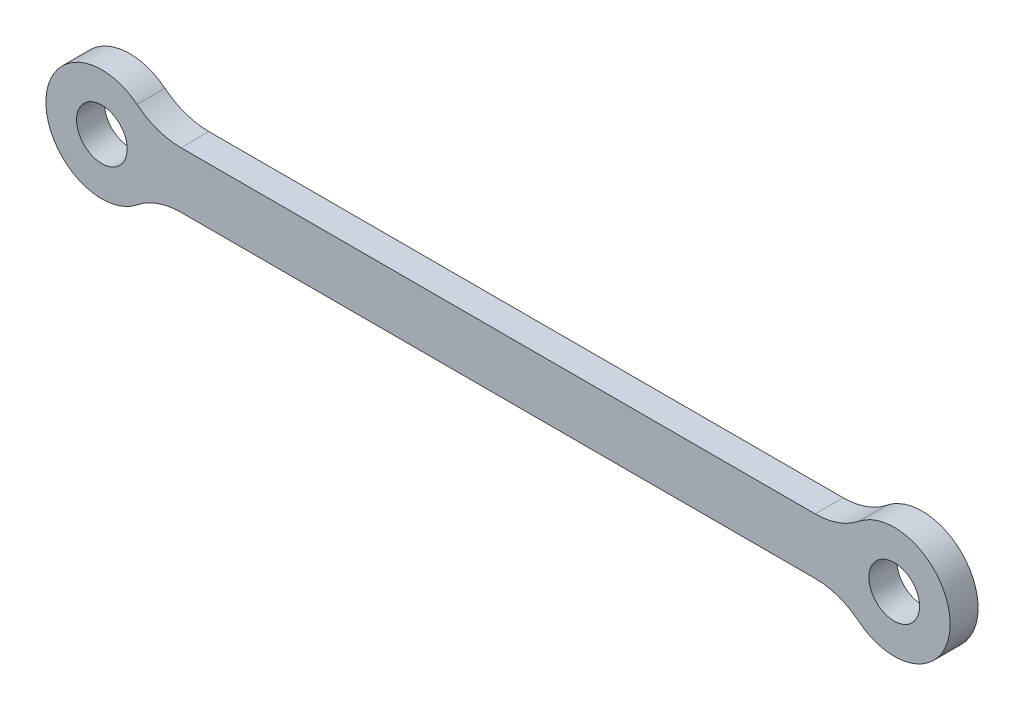
ISO-10303-21;
HEADER;
FILE_DESCRIPTION(('STEP AP214'),'2;1');
FILE_NAME('part.step','',(''),(''),'','','');
FILE_SCHEMA(('AUTOMOTIVE_DESIGN { 1 0 10303 214 1 1 1 1 }'));
ENDSEC;
DATA;
#1=APPLICATION_CONTEXT('core data for automotive mechanical design processes');
#2=APPLICATION_PROTOCOL_DEFINITION('international standard','automotive_design',2000,#1);
#3=PRODUCT_CONTEXT('',#1,'mechanical');
#4=PRODUCT('Part','Part','',(#3));
#5=PRODUCT_RELATED_PRODUCT_CATEGORY('part','',(#4));
#6=PRODUCT_DEFINITION_FORMATION('','',#4);
#7=PRODUCT_DEFINITION_CONTEXT('part definition',#1,'design');
#8=PRODUCT_DEFINITION('design','',#6,#7);
#9=PRODUCT_DEFINITION_SHAPE('','',#8);
#10=(LENGTH_UNIT() NAMED_UNIT(*) SI_UNIT(.MILLI.,.METRE.));
#11=(NAMED_UNIT(*) PLANE_ANGLE_UNIT() SI_UNIT($,.RADIAN.));
#12=(NAMED_UNIT(*) SI_UNIT($,.STERADIAN.) SOLID_ANGLE_UNIT());
#13=UNCERTAINTY_MEASURE_WITH_UNIT(LENGTH_MEASURE(1.E-05),#10,'distance_accuracy_value','');
#14=(GEOMETRIC_REPRESENTATION_CONTEXT(3) GLOBAL_UNCERTAINTY_ASSIGNED_CONTEXT((#13)) GLOBAL_UNIT_ASSIGNED_CONTEXT((#10,
#11,#12)) REPRESENTATION_CONTEXT('',''));
#15=CARTESIAN_POINT('',(0.,0.,0.));
#16=DIRECTION('',(0.,0.,1.));
#17=DIRECTION('',(1.,0.,0.));
#18=AXIS2_PLACEMENT_3D('',#15,#16,#17);
#19=CARTESIAN_POINT('',(129.564923539623,17.78,5.08));
#20=DIRECTION('',(0.,0.,-1.));
#21=DIRECTION('',(-1.,0.,0.));
#22=AXIS2_PLACEMENT_3D('',#19,#20,#21);
#23=PLANE('',#22);
#24=CARTESIAN_POINT('',(129.564923539623,17.78,5.08));
#25=DIRECTION('',(0.,0.,-1.));
#26=DIRECTION('',(-1.,0.,0.));
#27=AXIS2_PLACEMENT_3D('',#24,#25,#26);
#28=CIRCLE('',#27,12.7);
#29=CARTESIAN_POINT('',(137.547373425017,7.90222222222222,5.08));
#30=VERTEX_POINT('',#29);
#31=CARTESIAN_POINT('',(129.564923539623,5.08,5.08));
#32=VERTEX_POINT('',#31);
#33=EDGE_CURVE('E151',#30,#32,#28,.T.);
#34=ORIENTED_EDGE('',*,*,#33,.T.);
#35=DIRECTION('',(-1.,0.,0.));
#36=VECTOR('',#35,1.);
#37=CARTESIAN_POINT('',(14.3684097937106,5.08,5.08));
#38=LINE('',#37,#36);
#39=CARTESIAN_POINT('',(14.3684097937106,5.08,5.08));
#40=VERTEX_POINT('',#39);
#41=EDGE_CURVE('E99',#32,#40,#38,.T.);
#42=ORIENTED_EDGE('',*,*,#41,.T.);
#43=CARTESIAN_POINT('',(14.3684097937106,17.78,5.08));
#44=DIRECTION('',(0.,0.,-1.));
#45=DIRECTION('',(-1.,0.,0.));
#46=AXIS2_PLACEMENT_3D('',#43,#44,#45);
#47=CIRCLE('',#46,12.7);
#48=CARTESIAN_POINT('',(6.38595990831584,7.90222222222223,5.08));
#49=VERTEX_POINT('',#48);
#50=EDGE_CURVE('E166',#40,#49,#47,.T.);
#51=ORIENTED_EDGE('',*,*,#50,.T.);
#52=CARTESIAN_POINT('',(0.,0.,5.08));
#53=DIRECTION('',(0.,0.,1.));
#54=DIRECTION('',(1.,0.,0.));
#55=AXIS2_PLACEMENT_3D('',#52,#53,#54);
#56=CIRCLE('',#55,10.16);
#57=CARTESIAN_POINT('',(6.38595990831584,-7.90222222222222,5.08));
#58=VERTEX_POINT('',#57);
#59=EDGE_CURVE('E179',#49,#58,#56,.T.);
#60=ORIENTED_EDGE('',*,*,#59,.T.);
#61=CARTESIAN_POINT('',(14.3684097937106,-17.78,5.08));
#62=DIRECTION('',(0.,0.,-1.));
#63=DIRECTION('',(1.,0.,0.));
#64=AXIS2_PLACEMENT_3D('',#61,#62,#63);
#65=CIRCLE('',#64,12.7);
#66=CARTESIAN_POINT('',(14.3684097937106,-5.08,5.08));
#67=VERTEX_POINT('',#66);
#68=EDGE_CURVE('E118',#58,#67,#65,.T.);
#69=ORIENTED_EDGE('',*,*,#68,.T.);
#70=DIRECTION('',(1.,0.,0.));
#71=VECTOR('',#70,1.);
#72=CARTESIAN_POINT('',(14.3684097937106,-5.08,5.08));
#73=LINE('',#72,#71);
#74=CARTESIAN_POINT('',(129.564923539623,-5.08,5.08));
#75=VERTEX_POINT('',#74);
#76=EDGE_CURVE('E112',#67,#75,#73,.T.);
#77=ORIENTED_EDGE('',*,*,#76,.T.);
#78=CARTESIAN_POINT('',(129.564923539623,-17.78,5.08));
#79=DIRECTION('',(0.,0.,-1.));
#80=DIRECTION('',(-1.,0.,0.));
#81=AXIS2_PLACEMENT_3D('',#78,#79,#80);
#82=CIRCLE('',#81,12.7);
#83=CARTESIAN_POINT('',(137.547373425017,-7.90222222222222,5.08));
#84=VERTEX_POINT('',#83);
#85=EDGE_CURVE('E116',#75,#84,#82,.T.);
#86=ORIENTED_EDGE('',*,*,#85,.T.);
#87=CARTESIAN_POINT('',(143.933333333333,0.,5.08));
#88=DIRECTION('',(0.,0.,1.));
#89=DIRECTION('',(1.,0.,0.));
#90=AXIS2_PLACEMENT_3D('',#87,#88,#89);
#91=CIRCLE('',#90,10.16);
#92=EDGE_CURVE('E56',#84,#30,#91,.T.);
#93=ORIENTED_EDGE('',*,*,#92,.T.);
#94=EDGE_LOOP('',(#34,#42,#51,#60,#69,#77,#86,#93));
#95=FACE_BOUND('',#94,.T.);
#96=CARTESIAN_POINT('',(0.,0.,5.08));
#97=DIRECTION('',(0.,0.,1.));
#98=DIRECTION('',(1.,0.,0.));
#99=AXIS2_PLACEMENT_3D('',#96,#97,#98);
#100=CIRCLE('',#99,4.60375);
#101=CARTESIAN_POINT('',(4.60375,0.,5.08));
#102=VERTEX_POINT('',#101);
#103=EDGE_CURVE('E140',#102,#102,#100,.T.);
#104=ORIENTED_EDGE('',*,*,#103,.F.);
#105=EDGE_LOOP('',(#104));
#106=FACE_BOUND('',#105,.T.);
#107=CARTESIAN_POINT('',(143.933333333333,0.,5.08));
#108=DIRECTION('',(0.,0.,1.));
#109=DIRECTION('',(1.,0.,0.));
#110=AXIS2_PLACEMENT_3D('',#107,#108,#109);
#111=CIRCLE('',#110,4.60374999999998);
#112=CARTESIAN_POINT('',(148.537083333333,0.,5.08));
#113=VERTEX_POINT('',#112);
#114=EDGE_CURVE('E188',#113,#113,#111,.T.);
#115=ORIENTED_EDGE('',*,*,#114,.F.);
#116=EDGE_LOOP('',(#115));
#117=FACE_BOUND('',#116,.T.);
#118=ADVANCED_FACE('F39',(#95,#106,#117),#23,.F.);
#119=CARTESIAN_POINT('',(129.564923539623,17.78,0.));
#120=DIRECTION('',(0.,0.,-1.));
#121=DIRECTION('',(-1.,0.,0.));
#122=AXIS2_PLACEMENT_3D('',#119,#120,#121);
#123=PLANE('',#122);
#124=CARTESIAN_POINT('',(0.,0.,0.));
#125=DIRECTION('',(0.,0.,1.));
#126=DIRECTION('',(1.,0.,0.));
#127=AXIS2_PLACEMENT_3D('',#124,#125,#126);
#128=CIRCLE('',#127,4.60375);
#129=CARTESIAN_POINT('',(4.60375,0.,0.));
#130=VERTEX_POINT('',#129);
#131=EDGE_CURVE('E185',#130,#130,#128,.T.);
#132=ORIENTED_EDGE('',*,*,#131,.T.);
#133=EDGE_LOOP('',(#132));
#134=FACE_BOUND('',#133,.T.);
#135=CARTESIAN_POINT('',(129.564923539623,17.78,0.));
#136=DIRECTION('',(0.,0.,-1.));
#137=DIRECTION('',(-1.,0.,0.));
#138=AXIS2_PLACEMENT_3D('',#135,#136,#137);
#139=CIRCLE('',#138,12.7);
#140=CARTESIAN_POINT('',(137.547373425017,7.90222222222222,0.));
#141=VERTEX_POINT('',#140);
#142=CARTESIAN_POINT('',(129.564923539623,5.08,0.));
#143=VERTEX_POINT('',#142);
#144=EDGE_CURVE('E136',#141,#143,#139,.T.);
#145=ORIENTED_EDGE('',*,*,#144,.F.);
#146=CARTESIAN_POINT('',(143.933333333333,0.,0.));
#147=DIRECTION('',(0.,0.,1.));
#148=DIRECTION('',(1.,0.,0.));
#149=AXIS2_PLACEMENT_3D('',#146,#147,#148);
#150=CIRCLE('',#149,10.16);
#151=CARTESIAN_POINT('',(137.547373425017,-7.90222222222222,0.));
#152=VERTEX_POINT('',#151);
#153=EDGE_CURVE('E91',#152,#141,#150,.T.);
#154=ORIENTED_EDGE('',*,*,#153,.F.);
#155=CARTESIAN_POINT('',(129.564923539623,-17.78,0.));
#156=DIRECTION('',(0.,0.,-1.));
#157=DIRECTION('',(-1.,0.,0.));
#158=AXIS2_PLACEMENT_3D('',#155,#156,#157);
#159=CIRCLE('',#158,12.7);
#160=CARTESIAN_POINT('',(129.564923539623,-5.08,0.));
#161=VERTEX_POINT('',#160);
#162=EDGE_CURVE('E85',#161,#152,#159,.T.);
#163=ORIENTED_EDGE('',*,*,#162,.F.);
#164=DIRECTION('',(1.,0.,0.));
#165=VECTOR('',#164,1.);
#166=CARTESIAN_POINT('',(14.3684097937106,-5.08,0.));
#167=LINE('',#166,#165);
#168=CARTESIAN_POINT('',(14.3684097937106,-5.08,0.));
#169=VERTEX_POINT('',#168);
#170=EDGE_CURVE('E126',#169,#161,#167,.T.);
#171=ORIENTED_EDGE('',*,*,#170,.F.);
#172=CARTESIAN_POINT('',(14.3684097937106,-17.78,0.));
#173=DIRECTION('',(0.,0.,-1.));
#174=DIRECTION('',(1.,0.,0.));
#175=AXIS2_PLACEMENT_3D('',#172,#173,#174);
#176=CIRCLE('',#175,12.7);
#177=CARTESIAN_POINT('',(6.38595990831584,-7.90222222222222,0.));
#178=VERTEX_POINT('',#177);
#179=EDGE_CURVE('E146',#178,#169,#176,.T.);
#180=ORIENTED_EDGE('',*,*,#179,.F.);
#181=CARTESIAN_POINT('',(0.,0.,0.));
#182=DIRECTION('',(0.,0.,1.));
#183=DIRECTION('',(1.,0.,0.));
#184=AXIS2_PLACEMENT_3D('',#181,#182,#183);
#185=CIRCLE('',#184,10.16);
#186=CARTESIAN_POINT('',(6.38595990831584,7.90222222222223,0.));
#187=VERTEX_POINT('',#186);
#188=EDGE_CURVE('E144',#187,#178,#185,.T.);
#189=ORIENTED_EDGE('',*,*,#188,.F.);
#190=CARTESIAN_POINT('',(14.3684097937106,17.78,0.));
#191=DIRECTION('',(0.,0.,-1.));
#192=DIRECTION('',(-1.,0.,0.));
#193=AXIS2_PLACEMENT_3D('',#190,#191,#192);
#194=CIRCLE('',#193,12.7);
#195=CARTESIAN_POINT('',(14.3684097937106,5.08,0.));
#196=VERTEX_POINT('',#195);
#197=EDGE_CURVE('E142',#196,#187,#194,.T.);
#198=ORIENTED_EDGE('',*,*,#197,.F.);
#199=DIRECTION('',(-1.,0.,0.));
#200=VECTOR('',#199,1.);
#201=CARTESIAN_POINT('',(14.3684097937106,5.08,0.));
#202=LINE('',#201,#200);
#203=EDGE_CURVE('E139',#143,#196,#202,.T.);
#204=ORIENTED_EDGE('',*,*,#203,.F.);
#205=EDGE_LOOP('',(#145,#154,#163,#171,#180,#189,#198,#204));
#206=FACE_BOUND('',#205,.T.);
#207=CARTESIAN_POINT('',(143.933333333333,0.,0.));
#208=DIRECTION('',(0.,0.,1.));
#209=DIRECTION('',(1.,0.,0.));
#210=AXIS2_PLACEMENT_3D('',#207,#208,#209);
#211=CIRCLE('',#210,4.60374999999998);
#212=CARTESIAN_POINT('',(148.537083333333,0.,0.));
#213=VERTEX_POINT('',#212);
#214=EDGE_CURVE('E191',#213,#213,#211,.T.);
#215=ORIENTED_EDGE('',*,*,#214,.T.);
#216=EDGE_LOOP('',(#215));
#217=FACE_BOUND('',#216,.T.);
#218=ADVANCED_FACE('F170',(#134,#206,#217),#123,.T.);
#219=CARTESIAN_POINT('',(129.564923539623,17.78,5.08));
#220=DIRECTION('',(0.,0.,-1.));
#221=DIRECTION('',(-1.,0.,0.));
#222=AXIS2_PLACEMENT_3D('',#219,#220,#221);
#223=CYLINDRICAL_SURFACE('',#222,12.7);
#224=ORIENTED_EDGE('',*,*,#144,.T.);
#225=DIRECTION('',(0.,0.,-1.));
#226=VECTOR('',#225,1.);
#227=CARTESIAN_POINT('',(129.564923539623,5.08,5.08));
#228=LINE('',#227,#226);
#229=EDGE_CURVE('E11',#32,#143,#228,.T.);
#230=ORIENTED_EDGE('',*,*,#229,.F.);
#231=ORIENTED_EDGE('',*,*,#33,.F.);
#232=DIRECTION('',(0.,0.,-1.));
#233=VECTOR('',#232,1.);
#234=CARTESIAN_POINT('',(137.547373425017,7.90222222222222,5.08));
#235=LINE('',#234,#233);
#236=EDGE_CURVE('E132',#30,#141,#235,.T.);
#237=ORIENTED_EDGE('',*,*,#236,.T.);
#238=EDGE_LOOP('',(#224,#230,#231,#237));
#239=FACE_BOUND('',#238,.T.);
#240=ADVANCED_FACE('F41',(#239),#223,.F.);
#241=CARTESIAN_POINT('',(14.3684097937106,5.08,5.08));
#242=DIRECTION('',(0.,-1.,0.));
#243=DIRECTION('',(0.,0.,-1.));
#244=AXIS2_PLACEMENT_3D('',#241,#242,#243);
#245=PLANE('',#244);
#246=ORIENTED_EDGE('',*,*,#203,.T.);
#247=DIRECTION('',(0.,0.,-1.));
#248=VECTOR('',#247,1.);
#249=CARTESIAN_POINT('',(14.3684097937106,5.08,5.08));
#250=LINE('',#249,#248);
#251=EDGE_CURVE('E48',#40,#196,#250,.T.);
#252=ORIENTED_EDGE('',*,*,#251,.F.);
#253=ORIENTED_EDGE('',*,*,#41,.F.);
#254=ORIENTED_EDGE('',*,*,#229,.T.);
#255=EDGE_LOOP('',(#246,#252,#253,#254));
#256=FACE_BOUND('',#255,.T.);
#257=ADVANCED_FACE('F223',(#256),#245,.F.);
#258=CARTESIAN_POINT('',(14.3684097937106,17.78,5.08));
#259=DIRECTION('',(0.,0.,-1.));
#260=DIRECTION('',(-1.,0.,0.));
#261=AXIS2_PLACEMENT_3D('',#258,#259,#260);
#262=CYLINDRICAL_SURFACE('',#261,12.7);
#263=ORIENTED_EDGE('',*,*,#197,.T.);
#264=DIRECTION('',(0.,0.,-1.));
#265=VECTOR('',#264,1.);
#266=CARTESIAN_POINT('',(6.38595990831584,7.90222222222223,5.08));
#267=LINE('',#266,#265);
#268=EDGE_CURVE('E158',#49,#187,#267,.T.);
#269=ORIENTED_EDGE('',*,*,#268,.F.);
#270=ORIENTED_EDGE('',*,*,#50,.F.);
#271=ORIENTED_EDGE('',*,*,#251,.T.);
#272=EDGE_LOOP('',(#263,#269,#270,#271));
#273=FACE_BOUND('',#272,.T.);
#274=ADVANCED_FACE('F164',(#273),#262,.F.);
#275=CARTESIAN_POINT('',(0.,0.,5.08));
#276=DIRECTION('',(0.,0.,-1.));
#277=DIRECTION('',(-1.,0.,0.));
#278=AXIS2_PLACEMENT_3D('',#275,#276,#277);
#279=CYLINDRICAL_SURFACE('',#278,10.16);
#280=ORIENTED_EDGE('',*,*,#188,.T.);
#281=DIRECTION('',(0.,0.,-1.));
#282=VECTOR('',#281,1.);
#283=CARTESIAN_POINT('',(6.38595990831584,-7.90222222222222,5.08));
#284=LINE('',#283,#282);
#285=EDGE_CURVE('E155',#58,#178,#284,.T.);
#286=ORIENTED_EDGE('',*,*,#285,.F.);
#287=ORIENTED_EDGE('',*,*,#59,.F.);
#288=ORIENTED_EDGE('',*,*,#268,.T.);
#289=EDGE_LOOP('',(#280,#286,#287,#288));
#290=FACE_BOUND('',#289,.T.);
#291=ADVANCED_FACE('F175',(#290),#279,.T.);
#292=CARTESIAN_POINT('',(14.3684097937106,-17.78,5.08));
#293=DIRECTION('',(0.,0.,-1.));
#294=DIRECTION('',(-1.,0.,0.));
#295=AXIS2_PLACEMENT_3D('',#292,#293,#294);
#296=CYLINDRICAL_SURFACE('',#295,12.7);
#297=ORIENTED_EDGE('',*,*,#179,.T.);
#298=DIRECTION('',(0.,0.,-1.));
#299=VECTOR('',#298,1.);
#300=CARTESIAN_POINT('',(14.3684097937106,-5.08,5.08));
#301=LINE('',#300,#299);
#302=EDGE_CURVE('E127',#67,#169,#301,.T.);
#303=ORIENTED_EDGE('',*,*,#302,.F.);
#304=ORIENTED_EDGE('',*,*,#68,.F.);
#305=ORIENTED_EDGE('',*,*,#285,.T.);
#306=EDGE_LOOP('',(#297,#303,#304,#305));
#307=FACE_BOUND('',#306,.T.);
#308=ADVANCED_FACE('F178',(#307),#296,.F.);
#309=CARTESIAN_POINT('',(14.3684097937106,-5.08,5.08));
#310=DIRECTION('',(0.,1.,0.));
#311=DIRECTION('',(0.,0.,1.));
#312=AXIS2_PLACEMENT_3D('',#309,#310,#311);
#313=PLANE('',#312);
#314=ORIENTED_EDGE('',*,*,#170,.T.);
#315=DIRECTION('',(0.,0.,-1.));
#316=VECTOR('',#315,1.);
#317=CARTESIAN_POINT('',(129.564923539623,-5.08,5.08));
#318=LINE('',#317,#316);
#319=EDGE_CURVE('E123',#75,#161,#318,.T.);
#320=ORIENTED_EDGE('',*,*,#319,.F.);
#321=ORIENTED_EDGE('',*,*,#76,.F.);
#322=ORIENTED_EDGE('',*,*,#302,.T.);
#323=EDGE_LOOP('',(#314,#320,#321,#322));
#324=FACE_BOUND('',#323,.T.);
#325=ADVANCED_FACE('F124',(#324),#313,.F.);
#326=CARTESIAN_POINT('',(129.564923539623,-17.78,5.08));
#327=DIRECTION('',(0.,0.,-1.));
#328=DIRECTION('',(-1.,0.,0.));
#329=AXIS2_PLACEMENT_3D('',#326,#327,#328);
#330=CYLINDRICAL_SURFACE('',#329,12.7);
#331=ORIENTED_EDGE('',*,*,#162,.T.);
#332=DIRECTION('',(0.,0.,-1.));
#333=VECTOR('',#332,1.);
#334=CARTESIAN_POINT('',(137.547373425017,-7.90222222222222,5.08));
#335=LINE('',#334,#333);
#336=EDGE_CURVE('E128',#84,#152,#335,.T.);
#337=ORIENTED_EDGE('',*,*,#336,.F.);
#338=ORIENTED_EDGE('',*,*,#85,.F.);
#339=ORIENTED_EDGE('',*,*,#319,.T.);
#340=EDGE_LOOP('',(#331,#337,#338,#339));
#341=FACE_BOUND('',#340,.T.);
#342=ADVANCED_FACE('F130',(#341),#330,.F.);
#343=CARTESIAN_POINT('',(143.933333333333,0.,5.08));
#344=DIRECTION('',(0.,0.,-1.));
#345=DIRECTION('',(-1.,0.,0.));
#346=AXIS2_PLACEMENT_3D('',#343,#344,#345);
#347=CYLINDRICAL_SURFACE('',#346,10.16);
#348=ORIENTED_EDGE('',*,*,#153,.T.);
#349=ORIENTED_EDGE('',*,*,#236,.F.);
#350=ORIENTED_EDGE('',*,*,#92,.F.);
#351=ORIENTED_EDGE('',*,*,#336,.T.);
#352=EDGE_LOOP('',(#348,#349,#350,#351));
#353=FACE_BOUND('',#352,.T.);
#354=ADVANCED_FACE('F211',(#353),#347,.T.);
#355=CARTESIAN_POINT('',(0.,0.,5.08));
#356=DIRECTION('',(0.,0.,-1.));
#357=DIRECTION('',(-1.,0.,0.));
#358=AXIS2_PLACEMENT_3D('',#355,#356,#357);
#359=CYLINDRICAL_SURFACE('',#358,4.60375);
#360=ORIENTED_EDGE('',*,*,#103,.T.);
#361=EDGE_LOOP('',(#360));
#362=FACE_BOUND('',#361,.T.);
#363=ORIENTED_EDGE('',*,*,#131,.F.);
#364=EDGE_LOOP('',(#363));
#365=FACE_BOUND('',#364,.T.);
#366=ADVANCED_FACE('F208',(#362,#365),#359,.F.);
#367=CARTESIAN_POINT('',(143.933333333333,0.,5.08));
#368=DIRECTION('',(0.,0.,-1.));
#369=DIRECTION('',(-1.,0.,0.));
#370=AXIS2_PLACEMENT_3D('',#367,#368,#369);
#371=CYLINDRICAL_SURFACE('',#370,4.60374999999998);
#372=ORIENTED_EDGE('',*,*,#114,.T.);
#373=EDGE_LOOP('',(#372));
#374=FACE_BOUND('',#373,.T.);
#375=ORIENTED_EDGE('',*,*,#214,.F.);
#376=EDGE_LOOP('',(#375));
#377=FACE_BOUND('',#376,.T.);
#378=ADVANCED_FACE('F197',(#374,#377),#371,.F.);
#379=CLOSED_SHELL('',(#118,#218,#240,#257,#274,#291,#308,#325,#342,#354,#366,#378));
#380=MANIFOLD_SOLID_BREP('B2',#379);
#381=ADVANCED_BREP_SHAPE_REPRESENTATION('',(#18,#380),#14);
#382=SHAPE_DEFINITION_REPRESENTATION(#9,#381);
ENDSEC;
END-ISO-10303-21;
